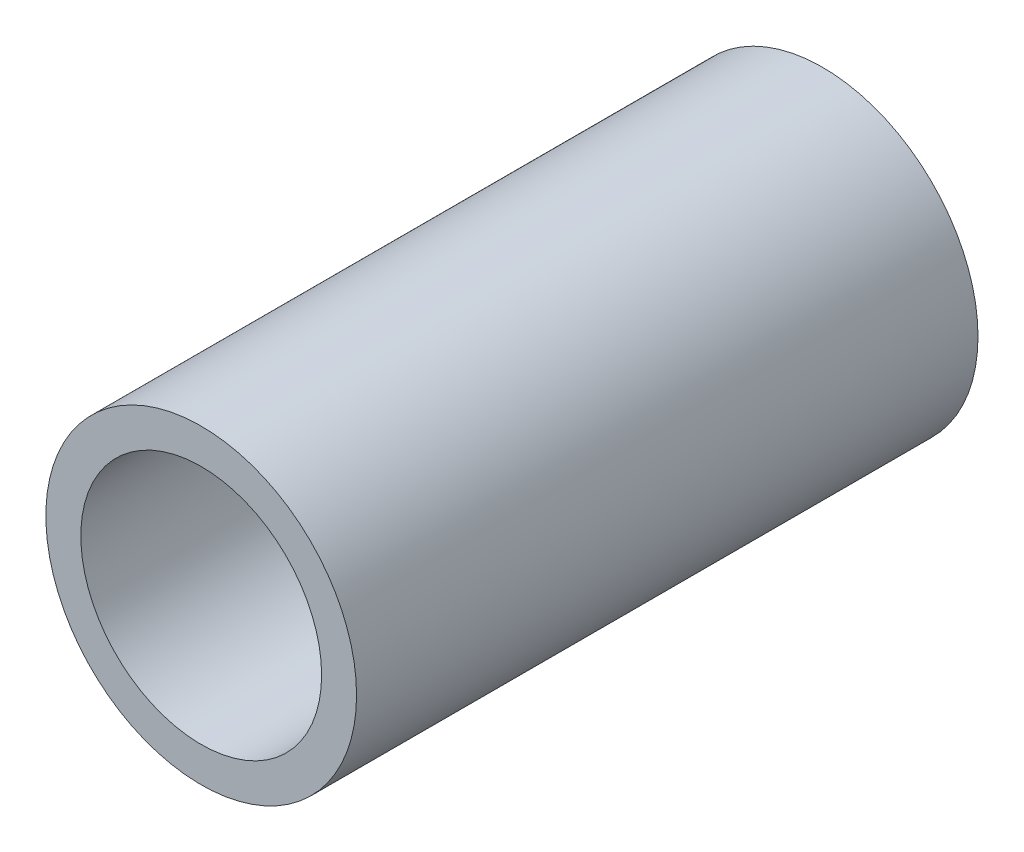
ISO-10303-21;
HEADER;
FILE_DESCRIPTION(('STEP AP214'),'2;1');
FILE_NAME('part.step','',(''),(''),'','','');
FILE_SCHEMA(('AUTOMOTIVE_DESIGN { 1 0 10303 214 1 1 1 1 }'));
ENDSEC;
DATA;
#1=APPLICATION_CONTEXT('core data for automotive mechanical design processes');
#2=APPLICATION_PROTOCOL_DEFINITION('international standard','automotive_design',2000,#1);
#3=PRODUCT_CONTEXT('',#1,'mechanical');
#4=PRODUCT('Part','Part','',(#3));
#5=PRODUCT_RELATED_PRODUCT_CATEGORY('part','',(#4));
#6=PRODUCT_DEFINITION_FORMATION('','',#4);
#7=PRODUCT_DEFINITION_CONTEXT('part definition',#1,'design');
#8=PRODUCT_DEFINITION('design','',#6,#7);
#9=PRODUCT_DEFINITION_SHAPE('','',#8);
#10=(LENGTH_UNIT() NAMED_UNIT(*) SI_UNIT(.MILLI.,.METRE.));
#11=(NAMED_UNIT(*) PLANE_ANGLE_UNIT() SI_UNIT($,.RADIAN.));
#12=(NAMED_UNIT(*) SI_UNIT($,.STERADIAN.) SOLID_ANGLE_UNIT());
#13=UNCERTAINTY_MEASURE_WITH_UNIT(LENGTH_MEASURE(1.E-05),#10,'distance_accuracy_value','');
#14=(GEOMETRIC_REPRESENTATION_CONTEXT(3) GLOBAL_UNCERTAINTY_ASSIGNED_CONTEXT((#13)) GLOBAL_UNIT_ASSIGNED_CONTEXT((#10,
#11,#12)) REPRESENTATION_CONTEXT('',''));
#15=CARTESIAN_POINT('',(0.,0.,0.));
#16=DIRECTION('',(0.,0.,1.));
#17=DIRECTION('',(1.,0.,0.));
#18=AXIS2_PLACEMENT_3D('',#15,#16,#17);
#19=CARTESIAN_POINT('',(0.,0.,4.));
#20=DIRECTION('',(0.,0.,1.));
#21=DIRECTION('',(1.,0.,0.));
#22=AXIS2_PLACEMENT_3D('',#19,#20,#21);
#23=PLANE('',#22);
#24=CARTESIAN_POINT('',(0.,0.,4.));
#25=DIRECTION('',(0.,0.,1.));
#26=DIRECTION('',(1.,0.,0.));
#27=AXIS2_PLACEMENT_3D('',#24,#25,#26);
#28=CIRCLE('',#27,2.);
#29=CARTESIAN_POINT('',(2.,0.,4.));
#30=VERTEX_POINT('',#29);
#31=EDGE_CURVE('E10',#30,#30,#28,.T.);
#32=ORIENTED_EDGE('',*,*,#31,.T.);
#33=EDGE_LOOP('',(#32));
#34=FACE_BOUND('',#33,.T.);
#35=CARTESIAN_POINT('',(0.,0.,4.));
#36=DIRECTION('',(0.,0.,1.));
#37=DIRECTION('',(1.,0.,0.));
#38=AXIS2_PLACEMENT_3D('',#35,#36,#37);
#39=CIRCLE('',#38,1.55);
#40=CARTESIAN_POINT('',(1.55,0.,4.));
#41=VERTEX_POINT('',#40);
#42=EDGE_CURVE('E42',#41,#41,#39,.T.);
#43=ORIENTED_EDGE('',*,*,#42,.F.);
#44=EDGE_LOOP('',(#43));
#45=FACE_BOUND('',#44,.T.);
#46=ADVANCED_FACE('F31',(#34,#45),#23,.T.);
#47=CARTESIAN_POINT('',(0.,0.,-4.));
#48=DIRECTION('',(0.,0.,1.));
#49=DIRECTION('',(1.,0.,0.));
#50=AXIS2_PLACEMENT_3D('',#47,#48,#49);
#51=PLANE('',#50);
#52=CARTESIAN_POINT('',(0.,0.,-4.));
#53=DIRECTION('',(0.,0.,1.));
#54=DIRECTION('',(1.,0.,0.));
#55=AXIS2_PLACEMENT_3D('',#52,#53,#54);
#56=CIRCLE('',#55,2.);
#57=CARTESIAN_POINT('',(2.,0.,-4.));
#58=VERTEX_POINT('',#57);
#59=EDGE_CURVE('E35',#58,#58,#56,.T.);
#60=ORIENTED_EDGE('',*,*,#59,.F.);
#61=EDGE_LOOP('',(#60));
#62=FACE_BOUND('',#61,.T.);
#63=CARTESIAN_POINT('',(0.,0.,-4.));
#64=DIRECTION('',(0.,0.,1.));
#65=DIRECTION('',(1.,0.,0.));
#66=AXIS2_PLACEMENT_3D('',#63,#64,#65);
#67=CIRCLE('',#66,1.55);
#68=CARTESIAN_POINT('',(1.55,0.,-4.));
#69=VERTEX_POINT('',#68);
#70=EDGE_CURVE('E44',#69,#69,#67,.T.);
#71=ORIENTED_EDGE('',*,*,#70,.T.);
#72=EDGE_LOOP('',(#71));
#73=FACE_BOUND('',#72,.T.);
#74=ADVANCED_FACE('F54',(#62,#73),#51,.F.);
#75=CARTESIAN_POINT('',(0.,0.,4.));
#76=DIRECTION('',(0.,0.,-1.));
#77=DIRECTION('',(-1.,0.,0.));
#78=AXIS2_PLACEMENT_3D('',#75,#76,#77);
#79=CYLINDRICAL_SURFACE('',#78,2.);
#80=ORIENTED_EDGE('',*,*,#31,.F.);
#81=EDGE_LOOP('',(#80));
#82=FACE_BOUND('',#81,.T.);
#83=ORIENTED_EDGE('',*,*,#59,.T.);
#84=EDGE_LOOP('',(#83));
#85=FACE_BOUND('',#84,.T.);
#86=ADVANCED_FACE('F33',(#82,#85),#79,.T.);
#87=CARTESIAN_POINT('',(0.,0.,4.));
#88=DIRECTION('',(0.,0.,-1.));
#89=DIRECTION('',(-1.,0.,0.));
#90=AXIS2_PLACEMENT_3D('',#87,#88,#89);
#91=CYLINDRICAL_SURFACE('',#90,1.55);
#92=ORIENTED_EDGE('',*,*,#42,.T.);
#93=EDGE_LOOP('',(#92));
#94=FACE_BOUND('',#93,.T.);
#95=ORIENTED_EDGE('',*,*,#70,.F.);
#96=EDGE_LOOP('',(#95));
#97=FACE_BOUND('',#96,.T.);
#98=ADVANCED_FACE('F50',(#94,#97),#91,.F.);
#99=CLOSED_SHELL('',(#46,#74,#86,#98));
#100=MANIFOLD_SOLID_BREP('B2',#99);
#101=ADVANCED_BREP_SHAPE_REPRESENTATION('',(#18,#100),#14);
#102=SHAPE_DEFINITION_REPRESENTATION(#9,#101);
ENDSEC;
END-ISO-10303-21;
